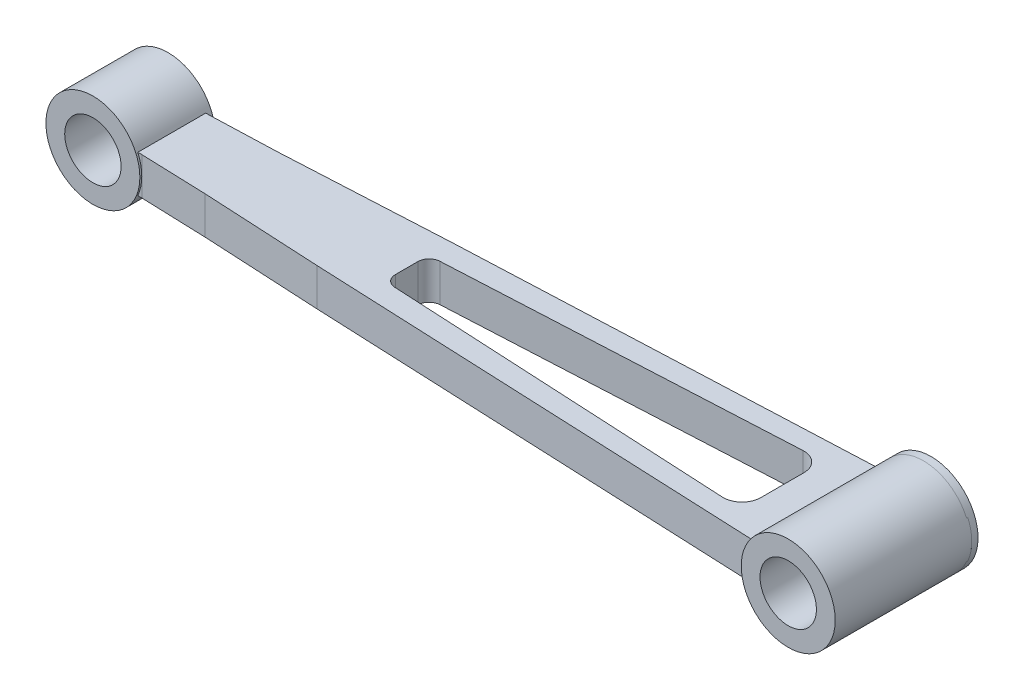
ISO-10303-21;
HEADER;
FILE_DESCRIPTION(('STEP AP214'),'2;1');
FILE_NAME('part.step','',(''),(''),'','','');
FILE_SCHEMA(('AUTOMOTIVE_DESIGN { 1 0 10303 214 1 1 1 1 }'));
ENDSEC;
DATA;
#1=APPLICATION_CONTEXT('core data for automotive mechanical design processes');
#2=APPLICATION_PROTOCOL_DEFINITION('international standard','automotive_design',2000,#1);
#3=PRODUCT_CONTEXT('',#1,'mechanical');
#4=PRODUCT('Part','Part','',(#3));
#5=PRODUCT_RELATED_PRODUCT_CATEGORY('part','',(#4));
#6=PRODUCT_DEFINITION_FORMATION('','',#4);
#7=PRODUCT_DEFINITION_CONTEXT('part definition',#1,'design');
#8=PRODUCT_DEFINITION('design','',#6,#7);
#9=PRODUCT_DEFINITION_SHAPE('','',#8);
#10=(LENGTH_UNIT() NAMED_UNIT(*) SI_UNIT(.MILLI.,.METRE.));
#11=(NAMED_UNIT(*) PLANE_ANGLE_UNIT() SI_UNIT($,.RADIAN.));
#12=(NAMED_UNIT(*) SI_UNIT($,.STERADIAN.) SOLID_ANGLE_UNIT());
#13=UNCERTAINTY_MEASURE_WITH_UNIT(LENGTH_MEASURE(1.E-05),#10,'distance_accuracy_value','');
#14=(GEOMETRIC_REPRESENTATION_CONTEXT(3) GLOBAL_UNCERTAINTY_ASSIGNED_CONTEXT((#13)) GLOBAL_UNIT_ASSIGNED_CONTEXT((#10,
#11,#12)) REPRESENTATION_CONTEXT('',''));
#15=CARTESIAN_POINT('',(0.,0.,0.));
#16=DIRECTION('',(0.,0.,1.));
#17=DIRECTION('',(1.,0.,0.));
#18=AXIS2_PLACEMENT_3D('',#15,#16,#17);
#19=CARTESIAN_POINT('',(0.,10.,0.));
#20=DIRECTION('',(0.,1.,0.));
#21=DIRECTION('',(0.,0.,1.));
#22=AXIS2_PLACEMENT_3D('',#19,#20,#21);
#23=PLANE('',#22);
#24=DIRECTION('',(1.,0.,0.));
#25=VECTOR('',#24,1.);
#26=CARTESIAN_POINT('',(0.,10.,-17.1798568796085));
#27=LINE('',#26,#25);
#28=CARTESIAN_POINT('',(218.516284317725,10.,-17.1798568796085));
#29=VERTEX_POINT('',#28);
#30=CARTESIAN_POINT('',(218.51643923739,10.,-17.1798568796085));
#31=VERTEX_POINT('',#30);
#32=EDGE_CURVE('E323',#29,#31,#27,.T.);
#33=ORIENTED_EDGE('',*,*,#32,.F.);
#34=DIRECTION('',(0.,0.,1.));
#35=VECTOR('',#34,1.);
#36=CARTESIAN_POINT('',(218.516284317725,10.,-18.8580500036445));
#37=LINE('',#36,#35);
#38=CARTESIAN_POINT('',(218.516284317725,10.,-16.8580500036445));
#39=VERTEX_POINT('',#38);
#40=EDGE_CURVE('E61',#29,#39,#37,.T.);
#41=ORIENTED_EDGE('',*,*,#40,.T.);
#42=DIRECTION('',(1.,0.,0.));
#43=VECTOR('',#42,1.);
#44=CARTESIAN_POINT('',(0.,10.,-16.8580500036445));
#45=LINE('',#44,#43);
#46=CARTESIAN_POINT('',(218.51643923739,10.,-16.8580500036445));
#47=VERTEX_POINT('',#46);
#48=EDGE_CURVE('E215',#39,#47,#45,.T.);
#49=ORIENTED_EDGE('',*,*,#48,.T.);
#50=DIRECTION('',(0.,0.,1.));
#51=VECTOR('',#50,1.);
#52=CARTESIAN_POINT('',(218.51643923739,10.,-17.1798568796085));
#53=LINE('',#52,#51);
#54=EDGE_CURVE('E237',#31,#47,#53,.T.);
#55=ORIENTED_EDGE('',*,*,#54,.F.);
#56=EDGE_LOOP('',(#33,#41,#49,#55));
#57=FACE_BOUND('',#56,.T.);
#58=ADVANCED_FACE('F45',(#57),#23,.T.);
#59=CARTESIAN_POINT('',(0.,0.,0.));
#60=DIRECTION('',(0.,1.,0.));
#61=DIRECTION('',(0.,0.,1.));
#62=AXIS2_PLACEMENT_3D('',#59,#60,#61);
#63=PLANE('',#62);
#64=DIRECTION('',(0.,0.,1.));
#65=VECTOR('',#64,1.);
#66=CARTESIAN_POINT('',(218.516284317725,0.,-18.8580500036445));
#67=LINE('',#66,#65);
#68=CARTESIAN_POINT('',(218.516284317725,0.,-17.1798568796085));
#69=VERTEX_POINT('',#68);
#70=CARTESIAN_POINT('',(218.516284317725,0.,-16.8580500036445));
#71=VERTEX_POINT('',#70);
#72=EDGE_CURVE('E11',#69,#71,#67,.T.);
#73=ORIENTED_EDGE('',*,*,#72,.F.);
#74=DIRECTION('',(1.,0.,0.));
#75=VECTOR('',#74,1.);
#76=CARTESIAN_POINT('',(0.,0.,-17.1798568796085));
#77=LINE('',#76,#75);
#78=CARTESIAN_POINT('',(218.51643923739,0.,-17.1798568796085));
#79=VERTEX_POINT('',#78);
#80=EDGE_CURVE('E386',#69,#79,#77,.T.);
#81=ORIENTED_EDGE('',*,*,#80,.T.);
#82=DIRECTION('',(0.,0.,1.));
#83=VECTOR('',#82,1.);
#84=CARTESIAN_POINT('',(218.51643923739,0.,-17.1798568796085));
#85=LINE('',#84,#83);
#86=CARTESIAN_POINT('',(218.51643923739,0.,-16.8580500036445));
#87=VERTEX_POINT('',#86);
#88=EDGE_CURVE('E205',#79,#87,#85,.T.);
#89=ORIENTED_EDGE('',*,*,#88,.T.);
#90=DIRECTION('',(1.,0.,0.));
#91=VECTOR('',#90,1.);
#92=CARTESIAN_POINT('',(0.,0.,-16.8580500036445));
#93=LINE('',#92,#91);
#94=EDGE_CURVE('E201',#71,#87,#93,.T.);
#95=ORIENTED_EDGE('',*,*,#94,.F.);
#96=EDGE_LOOP('',(#73,#81,#89,#95));
#97=FACE_BOUND('',#96,.T.);
#98=ADVANCED_FACE('F203',(#97),#63,.F.);
#99=DIRECTION('',(0.,0.,1.));
#100=VECTOR('',#99,1.);
#101=CARTESIAN_POINT('',(195.60356076261,10.,-16.8580500036445));
#102=LINE('',#101,#100);
#103=CARTESIAN_POINT('',(195.60356076261,10.,-16.67965794013));
#104=VERTEX_POINT('',#103);
#105=CARTESIAN_POINT('',(195.60356076261,10.,16.6417510568769));
#106=VERTEX_POINT('',#105);
#107=EDGE_CURVE('E257',#104,#106,#102,.T.);
#108=ORIENTED_EDGE('',*,*,#107,.F.);
#109=DIRECTION('',(0.999048221581858,0.,-0.0436193873653362));
#110=VECTOR('',#109,1.);
#111=CARTESIAN_POINT('',(-0.354698686758786,10.,-8.12393556185962));
#112=LINE('',#111,#110);
#113=CARTESIAN_POINT('',(86.39,10.,-11.9112908988383));
#114=VERTEX_POINT('',#113);
#115=EDGE_CURVE('E326',#114,#104,#112,.T.);
#116=ORIENTED_EDGE('',*,*,#115,.F.);
#117=DIRECTION('',(0.998629534754574,0.,-0.0523359562429444));
#118=VECTOR('',#117,1.);
#119=CARTESIAN_POINT('',(-0.385907737027346,10.,-7.36355827907058));
#120=LINE('',#119,#118);
#121=CARTESIAN_POINT('',(42.5,10.,-9.6111134661056));
#122=VERTEX_POINT('',#121);
#123=EDGE_CURVE('E330',#122,#114,#120,.T.);
#124=ORIENTED_EDGE('',*,*,#123,.F.);
#125=DIRECTION('',(0.999390827019096,0.,-0.0348994967025017));
#126=VECTOR('',#125,1.);
#127=CARTESIAN_POINT('',(-0.283454760096372,10.,-8.11708230436762));
#128=LINE('',#127,#126);
#129=CARTESIAN_POINT('',(25.,10.,-9.));
#130=VERTEX_POINT('',#129);
#131=EDGE_CURVE('E334',#130,#122,#128,.T.);
#132=ORIENTED_EDGE('',*,*,#131,.F.);
#133=DIRECTION('',(1.,0.,0.));
#134=VECTOR('',#133,1.);
#135=CARTESIAN_POINT('',(0.,10.,-9.));
#136=LINE('',#135,#134);
#137=CARTESIAN_POINT('',(23.9564392373896,10.,-9.));
#138=VERTEX_POINT('',#137);
#139=EDGE_CURVE('E338',#138,#130,#136,.T.);
#140=ORIENTED_EDGE('',*,*,#139,.F.);
#141=DIRECTION('',(0.,0.,1.));
#142=VECTOR('',#141,1.);
#143=CARTESIAN_POINT('',(23.9564392373896,10.,-9.92857142857143));
#144=LINE('',#143,#142);
#145=CARTESIAN_POINT('',(23.9564392373896,10.,9.07142857142857));
#146=VERTEX_POINT('',#145);
#147=EDGE_CURVE('E285',#146,#138,#144,.F.);
#148=ORIENTED_EDGE('',*,*,#147,.F.);
#149=DIRECTION('',(1.,0.,0.));
#150=VECTOR('',#149,1.);
#151=CARTESIAN_POINT('',(0.,10.,9.07142857142857));
#152=LINE('',#151,#150);
#153=CARTESIAN_POINT('',(25.,10.,9.07142857142857));
#154=VERTEX_POINT('',#153);
#155=EDGE_CURVE('E341',#146,#154,#152,.T.);
#156=ORIENTED_EDGE('',*,*,#155,.T.);
#157=DIRECTION('',(0.999390827019096,0.,0.0348994967025011));
#158=VECTOR('',#157,1.);
#159=CARTESIAN_POINT('',(-0.285946062730086,10.,8.18842387759121));
#160=LINE('',#159,#158);
#161=CARTESIAN_POINT('',(42.5,10.,9.68254203753416));
#162=VERTEX_POINT('',#161);
#163=EDGE_CURVE('E344',#154,#162,#160,.T.);
#164=ORIENTED_EDGE('',*,*,#163,.T.);
#165=DIRECTION('',(0.998629534754574,0.,0.052335956242944));
#166=VECTOR('',#165,1.);
#167=CARTESIAN_POINT('',(-0.389640896429759,10.,7.43479120390517));
#168=LINE('',#167,#166);
#169=CARTESIAN_POINT('',(73.89,10.,11.3276222292288));
#170=VERTEX_POINT('',#169);
#171=EDGE_CURVE('E347',#162,#170,#168,.T.);
#172=ORIENTED_EDGE('',*,*,#171,.T.);
#173=DIRECTION('',(0.999048221581858,0.,0.0436193873653361));
#174=VECTOR('',#173,1.);
#175=CARTESIAN_POINT('',(-0.3530467854762,10.,8.08610080217415));
#176=LINE('',#175,#174);
#177=EDGE_CURVE('E319',#170,#106,#176,.T.);
#178=ORIENTED_EDGE('',*,*,#177,.T.);
#179=EDGE_LOOP('',(#108,#116,#124,#132,#140,#148,#156,#164,#172,#178));
#180=FACE_BOUND('',#179,.T.);
#181=CARTESIAN_POINT('',(181.39,10.,-5.69951622560874));
#182=DIRECTION('',(0.,1.,0.));
#183=DIRECTION('',(0.,0.,1.));
#184=AXIS2_PLACEMENT_3D('',#181,#182,#183);
#185=CIRCLE('',#184,5.);
#186=CARTESIAN_POINT('',(186.39,10.,-5.69951622560874));
#187=VERTEX_POINT('',#186);
#188=CARTESIAN_POINT('',(181.13478275941,10.,-10.6929983934057));
#189=VERTEX_POINT('',#188);
#190=EDGE_CURVE('E289',#187,#189,#185,.T.);
#191=ORIENTED_EDGE('',*,*,#190,.F.);
#192=DIRECTION('',(0.,0.,-1.));
#193=VECTOR('',#192,1.);
#194=CARTESIAN_POINT('',(186.39,10.,0.));
#195=LINE('',#194,#193);
#196=CARTESIAN_POINT('',(186.39,10.,5.76341668184965));
#197=VERTEX_POINT('',#196);
#198=EDGE_CURVE('E293',#197,#187,#195,.T.);
#199=ORIENTED_EDGE('',*,*,#198,.F.);
#200=CARTESIAN_POINT('',(181.39,10.,5.76341668184965));
#201=DIRECTION('',(0.,1.,0.));
#202=DIRECTION('',(0.,0.,1.));
#203=AXIS2_PLACEMENT_3D('',#200,#201,#202);
#204=CIRCLE('',#203,5.);
#205=CARTESIAN_POINT('',(181.131319788138,10.,10.7567206529685));
#206=VERTEX_POINT('',#205);
#207=EDGE_CURVE('E298',#197,#206,#204,.F.);
#208=ORIENTED_EDGE('',*,*,#207,.T.);
#209=DIRECTION('',(0.998660794223762,0.,0.0517360423724691));
#210=VECTOR('',#209,1.);
#211=CARTESIAN_POINT('',(-0.0709455084105502,10.,1.36946110538967));
#212=LINE('',#211,#210);
#213=CARTESIAN_POINT('',(89.2347918728826,10.,5.99598238267128));
#214=VERTEX_POINT('',#213);
#215=EDGE_CURVE('E301',#214,#206,#212,.T.);
#216=ORIENTED_EDGE('',*,*,#215,.F.);
#217=CARTESIAN_POINT('',(89.39,10.,3.));
#218=DIRECTION('',(0.,1.,0.));
#219=DIRECTION('',(0.,0.,1.));
#220=AXIS2_PLACEMENT_3D('',#217,#218,#219);
#221=CIRCLE('',#220,3.);
#222=CARTESIAN_POINT('',(86.39,10.,3.));
#223=VERTEX_POINT('',#222);
#224=EDGE_CURVE('E305',#214,#223,#221,.F.);
#225=ORIENTED_EDGE('',*,*,#224,.T.);
#226=DIRECTION('',(0.,0.,1.));
#227=VECTOR('',#226,1.);
#228=CARTESIAN_POINT('',(86.39,10.,0.));
#229=LINE('',#228,#227);
#230=CARTESIAN_POINT('',(86.39,10.,-3.));
#231=VERTEX_POINT('',#230);
#232=EDGE_CURVE('E308',#231,#223,#229,.T.);
#233=ORIENTED_EDGE('',*,*,#232,.F.);
#234=CARTESIAN_POINT('',(89.39,10.,-3.));
#235=DIRECTION('',(0.,1.,0.));
#236=DIRECTION('',(0.,0.,1.));
#237=AXIS2_PLACEMENT_3D('',#234,#235,#236);
#238=CIRCLE('',#237,3.);
#239=CARTESIAN_POINT('',(89.2368696556462,10.,-5.99608930067815));
#240=VERTEX_POINT('',#239);
#241=EDGE_CURVE('E312',#231,#240,#238,.F.);
#242=ORIENTED_EDGE('',*,*,#241,.T.);
#243=DIRECTION('',(-0.998696433559383,0.,0.0510434481179471));
#244=VECTOR('',#243,1.);
#245=CARTESIAN_POINT('',(-0.0731613640039023,10.,-1.4314470514649));
#246=LINE('',#245,#244);
#247=EDGE_CURVE('E315',#189,#240,#246,.T.);
#248=ORIENTED_EDGE('',*,*,#247,.F.);
#249=EDGE_LOOP('',(#191,#199,#208,#216,#225,#233,#242,#248));
#250=FACE_BOUND('',#249,.T.);
#251=ADVANCED_FACE('F516',(#180,#250),#23,.T.);
#252=CARTESIAN_POINT('',(181.39,0.,-5.69951622560874));
#253=DIRECTION('',(0.,1.,0.));
#254=DIRECTION('',(0.,0.,1.));
#255=AXIS2_PLACEMENT_3D('',#252,#253,#254);
#256=CIRCLE('',#255,5.);
#257=CARTESIAN_POINT('',(186.39,0.,-5.69951622560874));
#258=VERTEX_POINT('',#257);
#259=CARTESIAN_POINT('',(181.13478275941,0.,-10.6929983934057));
#260=VERTEX_POINT('',#259);
#261=EDGE_CURVE('E288',#258,#260,#256,.T.);
#262=ORIENTED_EDGE('',*,*,#261,.T.);
#263=DIRECTION('',(-0.998696433559383,0.,0.0510434481179471));
#264=VECTOR('',#263,1.);
#265=CARTESIAN_POINT('',(-0.0731613640039023,0.,-1.4314470514649));
#266=LINE('',#265,#264);
#267=CARTESIAN_POINT('',(89.2368696556462,0.,-5.99608930067815));
#268=VERTEX_POINT('',#267);
#269=EDGE_CURVE('E378',#260,#268,#266,.T.);
#270=ORIENTED_EDGE('',*,*,#269,.T.);
#271=CARTESIAN_POINT('',(89.39,0.,-3.));
#272=DIRECTION('',(0.,1.,0.));
#273=DIRECTION('',(0.,0.,1.));
#274=AXIS2_PLACEMENT_3D('',#271,#272,#273);
#275=CIRCLE('',#274,3.);
#276=CARTESIAN_POINT('',(86.39,0.,-3.));
#277=VERTEX_POINT('',#276);
#278=EDGE_CURVE('E374',#277,#268,#275,.F.);
#279=ORIENTED_EDGE('',*,*,#278,.F.);
#280=DIRECTION('',(0.,0.,1.));
#281=VECTOR('',#280,1.);
#282=CARTESIAN_POINT('',(86.39,0.,0.));
#283=LINE('',#282,#281);
#284=CARTESIAN_POINT('',(86.39,0.,3.));
#285=VERTEX_POINT('',#284);
#286=EDGE_CURVE('E370',#277,#285,#283,.T.);
#287=ORIENTED_EDGE('',*,*,#286,.T.);
#288=CARTESIAN_POINT('',(89.39,0.,3.));
#289=DIRECTION('',(0.,1.,0.));
#290=DIRECTION('',(0.,0.,1.));
#291=AXIS2_PLACEMENT_3D('',#288,#289,#290);
#292=CIRCLE('',#291,3.);
#293=CARTESIAN_POINT('',(89.2347918728826,0.,5.99598238267128));
#294=VERTEX_POINT('',#293);
#295=EDGE_CURVE('E366',#294,#285,#292,.F.);
#296=ORIENTED_EDGE('',*,*,#295,.F.);
#297=DIRECTION('',(0.998660794223762,0.,0.0517360423724691));
#298=VECTOR('',#297,1.);
#299=CARTESIAN_POINT('',(-0.0709455084105502,0.,1.36946110538967));
#300=LINE('',#299,#298);
#301=CARTESIAN_POINT('',(181.131319788138,0.,10.7567206529685));
#302=VERTEX_POINT('',#301);
#303=EDGE_CURVE('E362',#294,#302,#300,.T.);
#304=ORIENTED_EDGE('',*,*,#303,.T.);
#305=CARTESIAN_POINT('',(181.39,0.,5.76341668184965));
#306=DIRECTION('',(0.,1.,0.));
#307=DIRECTION('',(0.,0.,1.));
#308=AXIS2_PLACEMENT_3D('',#305,#306,#307);
#309=CIRCLE('',#308,5.);
#310=CARTESIAN_POINT('',(186.39,0.,5.76341668184965));
#311=VERTEX_POINT('',#310);
#312=EDGE_CURVE('E358',#311,#302,#309,.F.);
#313=ORIENTED_EDGE('',*,*,#312,.F.);
#314=DIRECTION('',(0.,0.,-1.));
#315=VECTOR('',#314,1.);
#316=CARTESIAN_POINT('',(186.39,0.,0.));
#317=LINE('',#316,#315);
#318=EDGE_CURVE('E354',#311,#258,#317,.T.);
#319=ORIENTED_EDGE('',*,*,#318,.T.);
#320=EDGE_LOOP('',(#262,#270,#279,#287,#296,#304,#313,#319));
#321=FACE_BOUND('',#320,.T.);
#322=DIRECTION('',(0.999048221581858,0.,-0.0436193873653362));
#323=VECTOR('',#322,1.);
#324=CARTESIAN_POINT('',(-0.354698686758786,0.,-8.12393556185962));
#325=LINE('',#324,#323);
#326=CARTESIAN_POINT('',(86.39,0.,-11.9112908988383));
#327=VERTEX_POINT('',#326);
#328=CARTESIAN_POINT('',(195.60356076261,0.,-16.67965794013));
#329=VERTEX_POINT('',#328);
#330=EDGE_CURVE('E389',#327,#329,#325,.T.);
#331=ORIENTED_EDGE('',*,*,#330,.T.);
#332=DIRECTION('',(0.,0.,1.));
#333=VECTOR('',#332,1.);
#334=CARTESIAN_POINT('',(195.60356076261,0.,-16.8580500036445));
#335=LINE('',#334,#333);
#336=CARTESIAN_POINT('',(195.60356076261,0.,16.6417510568769));
#337=VERTEX_POINT('',#336);
#338=EDGE_CURVE('E54',#329,#337,#335,.T.);
#339=ORIENTED_EDGE('',*,*,#338,.T.);
#340=DIRECTION('',(0.999048221581858,0.,0.0436193873653361));
#341=VECTOR('',#340,1.);
#342=CARTESIAN_POINT('',(-0.3530467854762,0.,8.08610080217415));
#343=LINE('',#342,#341);
#344=CARTESIAN_POINT('',(73.89,0.,11.3276222292288));
#345=VERTEX_POINT('',#344);
#346=EDGE_CURVE('E382',#345,#337,#343,.T.);
#347=ORIENTED_EDGE('',*,*,#346,.F.);
#348=DIRECTION('',(0.998629534754574,0.,0.052335956242944));
#349=VECTOR('',#348,1.);
#350=CARTESIAN_POINT('',(-0.389640896429759,0.,7.43479120390517));
#351=LINE('',#350,#349);
#352=CARTESIAN_POINT('',(42.5,0.,9.68254203753416));
#353=VERTEX_POINT('',#352);
#354=EDGE_CURVE('E294',#353,#345,#351,.T.);
#355=ORIENTED_EDGE('',*,*,#354,.F.);
#356=DIRECTION('',(0.999390827019096,0.,0.0348994967025011));
#357=VECTOR('',#356,1.);
#358=CARTESIAN_POINT('',(-0.285946062730086,0.,8.18842387759121));
#359=LINE('',#358,#357);
#360=CARTESIAN_POINT('',(25.,0.,9.07142857142857));
#361=VERTEX_POINT('',#360);
#362=EDGE_CURVE('E409',#361,#353,#359,.T.);
#363=ORIENTED_EDGE('',*,*,#362,.F.);
#364=DIRECTION('',(1.,0.,0.));
#365=VECTOR('',#364,1.);
#366=CARTESIAN_POINT('',(0.,0.,9.07142857142857));
#367=LINE('',#366,#365);
#368=CARTESIAN_POINT('',(23.9564392373896,0.,9.07142857142857));
#369=VERTEX_POINT('',#368);
#370=EDGE_CURVE('E405',#369,#361,#367,.T.);
#371=ORIENTED_EDGE('',*,*,#370,.F.);
#372=DIRECTION('',(0.,0.,1.));
#373=VECTOR('',#372,1.);
#374=CARTESIAN_POINT('',(23.9564392373896,0.,-9.92857142857143));
#375=LINE('',#374,#373);
#376=CARTESIAN_POINT('',(23.9564392373896,0.,-9.));
#377=VERTEX_POINT('',#376);
#378=EDGE_CURVE('E210',#369,#377,#375,.F.);
#379=ORIENTED_EDGE('',*,*,#378,.T.);
#380=DIRECTION('',(1.,0.,0.));
#381=VECTOR('',#380,1.);
#382=CARTESIAN_POINT('',(0.,0.,-9.));
#383=LINE('',#382,#381);
#384=CARTESIAN_POINT('',(25.,0.,-9.));
#385=VERTEX_POINT('',#384);
#386=EDGE_CURVE('E401',#377,#385,#383,.T.);
#387=ORIENTED_EDGE('',*,*,#386,.T.);
#388=DIRECTION('',(0.999390827019096,0.,-0.0348994967025017));
#389=VECTOR('',#388,1.);
#390=CARTESIAN_POINT('',(-0.283454760096372,0.,-8.11708230436762));
#391=LINE('',#390,#389);
#392=CARTESIAN_POINT('',(42.5,0.,-9.6111134661056));
#393=VERTEX_POINT('',#392);
#394=EDGE_CURVE('E397',#385,#393,#391,.T.);
#395=ORIENTED_EDGE('',*,*,#394,.T.);
#396=DIRECTION('',(0.998629534754574,0.,-0.0523359562429444));
#397=VECTOR('',#396,1.);
#398=CARTESIAN_POINT('',(-0.385907737027346,0.,-7.36355827907058));
#399=LINE('',#398,#397);
#400=EDGE_CURVE('E393',#393,#327,#399,.T.);
#401=ORIENTED_EDGE('',*,*,#400,.T.);
#402=EDGE_LOOP('',(#331,#339,#347,#355,#363,#371,#379,#387,#395,#401));
#403=FACE_BOUND('',#402,.T.);
#404=ADVANCED_FACE('F467',(#321,#403),#63,.F.);
#405=CARTESIAN_POINT('',(0.,10.,9.07142857142857));
#406=DIRECTION('',(0.,0.,-1.));
#407=DIRECTION('',(-1.,0.,0.));
#408=AXIS2_PLACEMENT_3D('',#405,#406,#407);
#409=PLANE('',#408);
#410=CARTESIAN_POINT('',(12.5,5.,9.07142857142857));
#411=DIRECTION('',(0.,0.,1.));
#412=DIRECTION('',(1.,0.,0.));
#413=AXIS2_PLACEMENT_3D('',#410,#411,#412);
#414=CIRCLE('',#413,12.5);
#415=CARTESIAN_POINT('',(25.,5.,9.07142857142857));
#416=VERTEX_POINT('',#415);
#417=EDGE_CURVE('E272',#369,#416,#414,.T.);
#418=ORIENTED_EDGE('',*,*,#417,.F.);
#419=ORIENTED_EDGE('',*,*,#370,.T.);
#420=DIRECTION('',(0.,-1.,0.));
#421=VECTOR('',#420,1.);
#422=CARTESIAN_POINT('',(25.,10.,9.07142857142857));
#423=LINE('',#422,#421);
#424=EDGE_CURVE('E423',#416,#361,#423,.T.);
#425=ORIENTED_EDGE('',*,*,#424,.F.);
#426=EDGE_LOOP('',(#418,#419,#425));
#427=FACE_BOUND('',#426,.T.);
#428=ADVANCED_FACE('F491',(#427),#409,.F.);
#429=EDGE_CURVE('E278',#416,#146,#414,.T.);
#430=ORIENTED_EDGE('',*,*,#429,.F.);
#431=EDGE_CURVE('E424',#154,#416,#423,.T.);
#432=ORIENTED_EDGE('',*,*,#431,.F.);
#433=ORIENTED_EDGE('',*,*,#155,.F.);
#434=EDGE_LOOP('',(#430,#432,#433));
#435=FACE_BOUND('',#434,.T.);
#436=ADVANCED_FACE('F521',(#435),#409,.F.);
#437=CARTESIAN_POINT('',(12.5,5.,-9.92857142857143));
#438=DIRECTION('',(0.,0.,1.));
#439=DIRECTION('',(1.,0.,0.));
#440=AXIS2_PLACEMENT_3D('',#437,#438,#439);
#441=CYLINDRICAL_SURFACE('',#440,12.5);
#442=ORIENTED_EDGE('',*,*,#378,.F.);
#443=ORIENTED_EDGE('',*,*,#417,.T.);
#444=ORIENTED_EDGE('',*,*,#429,.T.);
#445=ORIENTED_EDGE('',*,*,#147,.T.);
#446=CARTESIAN_POINT('',(12.5,5.,-9.));
#447=DIRECTION('',(0.,0.,-1.));
#448=DIRECTION('',(-1.,0.,0.));
#449=AXIS2_PLACEMENT_3D('',#446,#447,#448);
#450=CIRCLE('',#449,12.5);
#451=CARTESIAN_POINT('',(25.,5.,-9.));
#452=VERTEX_POINT('',#451);
#453=EDGE_CURVE('E284',#138,#452,#450,.T.);
#454=ORIENTED_EDGE('',*,*,#453,.T.);
#455=EDGE_CURVE('E277',#452,#377,#450,.T.);
#456=ORIENTED_EDGE('',*,*,#455,.T.);
#457=EDGE_LOOP('',(#442,#443,#444,#445,#454,#456));
#458=FACE_BOUND('',#457,.T.);
#459=CARTESIAN_POINT('',(12.5,5.,9.57142857142857));
#460=DIRECTION('',(0.,0.,1.));
#461=DIRECTION('',(1.,0.,0.));
#462=AXIS2_PLACEMENT_3D('',#459,#460,#461);
#463=CIRCLE('',#462,12.5);
#464=CARTESIAN_POINT('',(25.,5.,9.57142857142857));
#465=VERTEX_POINT('',#464);
#466=EDGE_CURVE('E273',#465,#465,#463,.T.);
#467=ORIENTED_EDGE('',*,*,#466,.F.);
#468=EDGE_LOOP('',(#467));
#469=FACE_BOUND('',#468,.T.);
#470=CARTESIAN_POINT('',(12.5,5.,-10.4285714285714));
#471=DIRECTION('',(0.,0.,-1.));
#472=DIRECTION('',(-1.,0.,0.));
#473=AXIS2_PLACEMENT_3D('',#470,#471,#472);
#474=CIRCLE('',#473,12.5);
#475=CARTESIAN_POINT('',(0.,5.,-10.4285714285714));
#476=VERTEX_POINT('',#475);
#477=EDGE_CURVE('E268',#476,#476,#474,.T.);
#478=ORIENTED_EDGE('',*,*,#477,.F.);
#479=EDGE_LOOP('',(#478));
#480=FACE_BOUND('',#479,.T.);
#481=ADVANCED_FACE('F522',(#458,#469,#480),#441,.T.);
#482=CARTESIAN_POINT('',(0.,10.,-9.));
#483=DIRECTION('',(0.,0.,-1.));
#484=DIRECTION('',(-1.,0.,0.));
#485=AXIS2_PLACEMENT_3D('',#482,#483,#484);
#486=PLANE('',#485);
#487=ORIENTED_EDGE('',*,*,#453,.F.);
#488=ORIENTED_EDGE('',*,*,#139,.T.);
#489=DIRECTION('',(0.,-1.,0.));
#490=VECTOR('',#489,1.);
#491=CARTESIAN_POINT('',(25.,10.,-9.));
#492=LINE('',#491,#490);
#493=EDGE_CURVE('E429',#130,#452,#492,.T.);
#494=ORIENTED_EDGE('',*,*,#493,.T.);
#495=EDGE_LOOP('',(#487,#488,#494));
#496=FACE_BOUND('',#495,.T.);
#497=ADVANCED_FACE('F526',(#496),#486,.T.);
#498=ORIENTED_EDGE('',*,*,#455,.F.);
#499=EDGE_CURVE('E428',#452,#385,#492,.T.);
#500=ORIENTED_EDGE('',*,*,#499,.T.);
#501=ORIENTED_EDGE('',*,*,#386,.F.);
#502=EDGE_LOOP('',(#498,#500,#501));
#503=FACE_BOUND('',#502,.T.);
#504=ADVANCED_FACE('F500',(#503),#486,.T.);
#505=CARTESIAN_POINT('',(-0.3530467854762,10.,8.08610080217415));
#506=DIRECTION('',(0.0436193873653361,0.,-0.999048221581858));
#507=DIRECTION('',(-0.999048221581858,0.,-0.0436193873653361));
#508=AXIS2_PLACEMENT_3D('',#505,#506,#507);
#509=PLANE('',#508);
#510=ORIENTED_EDGE('',*,*,#346,.T.);
#511=CARTESIAN_POINT('',(207.06,5.,17.1419499963554));
#512=DIRECTION('',(0.0436193873653361,0.,-0.999048221581858));
#513=DIRECTION('',(0.999048221581858,0.,0.0436193873653361));
#514=AXIS2_PLACEMENT_3D('',#511,#512,#513);
#515=ELLIPSE('',#514,12.5119085645415,12.5);
#516=EDGE_CURVE('E253',#337,#106,#515,.T.);
#517=ORIENTED_EDGE('',*,*,#516,.T.);
#518=ORIENTED_EDGE('',*,*,#177,.F.);
#519=DIRECTION('',(0.,-1.,0.));
#520=VECTOR('',#519,1.);
#521=CARTESIAN_POINT('',(73.89,10.,11.3276222292288));
#522=LINE('',#521,#520);
#523=EDGE_CURVE('E414',#170,#345,#522,.T.);
#524=ORIENTED_EDGE('',*,*,#523,.T.);
#525=EDGE_LOOP('',(#510,#517,#518,#524));
#526=FACE_BOUND('',#525,.T.);
#527=ADVANCED_FACE('F473',(#526),#509,.F.);
#528=CARTESIAN_POINT('',(-0.354698686758786,10.,-8.12393556185962));
#529=DIRECTION('',(-0.0436193873653362,0.,-0.999048221581858));
#530=DIRECTION('',(-0.999048221581858,0.,0.0436193873653362));
#531=AXIS2_PLACEMENT_3D('',#528,#529,#530);
#532=PLANE('',#531);
#533=CARTESIAN_POINT('',(207.06,5.,-17.1798568796085));
#534=DIRECTION('',(-0.0436193873653362,0.,-0.999048221581858));
#535=DIRECTION('',(-0.999048221581858,0.,0.0436193873653362));
#536=AXIS2_PLACEMENT_3D('',#533,#534,#535);
#537=ELLIPSE('',#536,12.5119085645415,12.5);
#538=EDGE_CURVE('E250',#329,#104,#537,.T.);
#539=ORIENTED_EDGE('',*,*,#538,.F.);
#540=ORIENTED_EDGE('',*,*,#330,.F.);
#541=DIRECTION('',(0.,-1.,0.));
#542=VECTOR('',#541,1.);
#543=CARTESIAN_POINT('',(86.39,10.,-11.9112908988383));
#544=LINE('',#543,#542);
#545=EDGE_CURVE('E436',#114,#327,#544,.T.);
#546=ORIENTED_EDGE('',*,*,#545,.F.);
#547=ORIENTED_EDGE('',*,*,#115,.T.);
#548=EDGE_LOOP('',(#539,#540,#546,#547));
#549=FACE_BOUND('',#548,.T.);
#550=ADVANCED_FACE('F512',(#549),#532,.T.);
#551=CARTESIAN_POINT('',(-0.385907737027346,10.,-7.36355827907058));
#552=DIRECTION('',(-0.0523359562429443,0.,-0.998629534754574));
#553=DIRECTION('',(-0.998629534754574,0.,0.0523359562429444));
#554=AXIS2_PLACEMENT_3D('',#551,#552,#553);
#555=PLANE('',#554);
#556=ORIENTED_EDGE('',*,*,#400,.F.);
#557=DIRECTION('',(0.,-1.,0.));
#558=VECTOR('',#557,1.);
#559=CARTESIAN_POINT('',(42.5,10.,-9.6111134661056));
#560=LINE('',#559,#558);
#561=EDGE_CURVE('E433',#122,#393,#560,.T.);
#562=ORIENTED_EDGE('',*,*,#561,.F.);
#563=ORIENTED_EDGE('',*,*,#123,.T.);
#564=ORIENTED_EDGE('',*,*,#545,.T.);
#565=EDGE_LOOP('',(#556,#562,#563,#564));
#566=FACE_BOUND('',#565,.T.);
#567=ADVANCED_FACE('F509',(#566),#555,.T.);
#568=CARTESIAN_POINT('',(-0.283454760096372,10.,-8.11708230436762));
#569=DIRECTION('',(-0.0348994967025017,0.,-0.999390827019096));
#570=DIRECTION('',(-0.999390827019096,0.,0.0348994967025017));
#571=AXIS2_PLACEMENT_3D('',#568,#569,#570);
#572=PLANE('',#571);
#573=ORIENTED_EDGE('',*,*,#394,.F.);
#574=ORIENTED_EDGE('',*,*,#499,.F.);
#575=ORIENTED_EDGE('',*,*,#493,.F.);
#576=ORIENTED_EDGE('',*,*,#131,.T.);
#577=ORIENTED_EDGE('',*,*,#561,.T.);
#578=EDGE_LOOP('',(#573,#574,#575,#576,#577));
#579=FACE_BOUND('',#578,.T.);
#580=ADVANCED_FACE('F504',(#579),#572,.T.);
#581=CARTESIAN_POINT('',(-0.285946062730086,10.,8.18842387759121));
#582=DIRECTION('',(0.034899496702501,0.,-0.999390827019096));
#583=DIRECTION('',(-0.999390827019096,0.,-0.034899496702501));
#584=AXIS2_PLACEMENT_3D('',#581,#582,#583);
#585=PLANE('',#584);
#586=ORIENTED_EDGE('',*,*,#362,.T.);
#587=DIRECTION('',(0.,-1.,0.));
#588=VECTOR('',#587,1.);
#589=CARTESIAN_POINT('',(42.5,10.,9.68254203753416));
#590=LINE('',#589,#588);
#591=EDGE_CURVE('E418',#162,#353,#590,.T.);
#592=ORIENTED_EDGE('',*,*,#591,.F.);
#593=ORIENTED_EDGE('',*,*,#163,.F.);
#594=ORIENTED_EDGE('',*,*,#431,.T.);
#595=ORIENTED_EDGE('',*,*,#424,.T.);
#596=EDGE_LOOP('',(#586,#592,#593,#594,#595));
#597=FACE_BOUND('',#596,.T.);
#598=ADVANCED_FACE('F483',(#597),#585,.F.);
#599=CARTESIAN_POINT('',(181.39,10.,-5.69951622560874));
#600=DIRECTION('',(0.,-1.,0.));
#601=DIRECTION('',(0.,0.,-1.));
#602=AXIS2_PLACEMENT_3D('',#599,#600,#601);
#603=CYLINDRICAL_SURFACE('',#602,5.);
#604=ORIENTED_EDGE('',*,*,#261,.F.);
#605=DIRECTION('',(0.,-1.,0.));
#606=VECTOR('',#605,1.);
#607=CARTESIAN_POINT('',(186.39,10.,-5.69951622560874));
#608=LINE('',#607,#606);
#609=EDGE_CURVE('E419',#187,#258,#608,.T.);
#610=ORIENTED_EDGE('',*,*,#609,.F.);
#611=ORIENTED_EDGE('',*,*,#190,.T.);
#612=DIRECTION('',(0.,-1.,0.));
#613=VECTOR('',#612,1.);
#614=CARTESIAN_POINT('',(181.13478275941,10.,-10.6929983934057));
#615=LINE('',#614,#613);
#616=EDGE_CURVE('E350',#189,#260,#615,.T.);
#617=ORIENTED_EDGE('',*,*,#616,.T.);
#618=EDGE_LOOP('',(#604,#610,#611,#617));
#619=FACE_BOUND('',#618,.T.);
#620=ADVANCED_FACE('F47',(#619),#603,.F.);
#621=CARTESIAN_POINT('',(186.39,10.,0.));
#622=DIRECTION('',(-1.,0.,0.));
#623=DIRECTION('',(0.,0.,1.));
#624=AXIS2_PLACEMENT_3D('',#621,#622,#623);
#625=PLANE('',#624);
#626=ORIENTED_EDGE('',*,*,#318,.F.);
#627=DIRECTION('',(0.,-1.,0.));
#628=VECTOR('',#627,1.);
#629=CARTESIAN_POINT('',(186.39,10.,5.76341668184965));
#630=LINE('',#629,#628);
#631=EDGE_CURVE('E456',#197,#311,#630,.T.);
#632=ORIENTED_EDGE('',*,*,#631,.F.);
#633=ORIENTED_EDGE('',*,*,#198,.T.);
#634=ORIENTED_EDGE('',*,*,#609,.T.);
#635=EDGE_LOOP('',(#626,#632,#633,#634));
#636=FACE_BOUND('',#635,.T.);
#637=ADVANCED_FACE('F563',(#636),#625,.T.);
#638=CARTESIAN_POINT('',(181.39,10.,5.76341668184965));
#639=DIRECTION('',(0.,-1.,0.));
#640=DIRECTION('',(0.,0.,-1.));
#641=AXIS2_PLACEMENT_3D('',#638,#639,#640);
#642=CYLINDRICAL_SURFACE('',#641,5.);
#643=ORIENTED_EDGE('',*,*,#312,.T.);
#644=DIRECTION('',(0.,-1.,0.));
#645=VECTOR('',#644,1.);
#646=CARTESIAN_POINT('',(181.131319788138,10.,10.7567206529685));
#647=LINE('',#646,#645);
#648=EDGE_CURVE('E453',#206,#302,#647,.T.);
#649=ORIENTED_EDGE('',*,*,#648,.F.);
#650=ORIENTED_EDGE('',*,*,#207,.F.);
#651=ORIENTED_EDGE('',*,*,#631,.T.);
#652=EDGE_LOOP('',(#643,#649,#650,#651));
#653=FACE_BOUND('',#652,.T.);
#654=ADVANCED_FACE('F596',(#653),#642,.F.);
#655=CARTESIAN_POINT('',(-0.0709455084105502,10.,1.36946110538967));
#656=DIRECTION('',(0.0517360423724691,0.,-0.998660794223761));
#657=DIRECTION('',(-0.998660794223762,0.,-0.0517360423724692));
#658=AXIS2_PLACEMENT_3D('',#655,#656,#657);
#659=PLANE('',#658);
#660=ORIENTED_EDGE('',*,*,#303,.F.);
#661=DIRECTION('',(0.,-1.,0.));
#662=VECTOR('',#661,1.);
#663=CARTESIAN_POINT('',(89.2347918728826,10.,5.99598238267128));
#664=LINE('',#663,#662);
#665=EDGE_CURVE('E450',#214,#294,#664,.T.);
#666=ORIENTED_EDGE('',*,*,#665,.F.);
#667=ORIENTED_EDGE('',*,*,#215,.T.);
#668=ORIENTED_EDGE('',*,*,#648,.T.);
#669=EDGE_LOOP('',(#660,#666,#667,#668));
#670=FACE_BOUND('',#669,.T.);
#671=ADVANCED_FACE('F592',(#670),#659,.T.);
#672=CARTESIAN_POINT('',(89.39,10.,3.));
#673=DIRECTION('',(0.,-1.,0.));
#674=DIRECTION('',(0.,0.,-1.));
#675=AXIS2_PLACEMENT_3D('',#672,#673,#674);
#676=CYLINDRICAL_SURFACE('',#675,3.);
#677=ORIENTED_EDGE('',*,*,#295,.T.);
#678=DIRECTION('',(0.,-1.,0.));
#679=VECTOR('',#678,1.);
#680=CARTESIAN_POINT('',(86.39,10.,3.));
#681=LINE('',#680,#679);
#682=EDGE_CURVE('E447',#223,#285,#681,.T.);
#683=ORIENTED_EDGE('',*,*,#682,.F.);
#684=ORIENTED_EDGE('',*,*,#224,.F.);
#685=ORIENTED_EDGE('',*,*,#665,.T.);
#686=EDGE_LOOP('',(#677,#683,#684,#685));
#687=FACE_BOUND('',#686,.T.);
#688=ADVANCED_FACE('F588',(#687),#676,.F.);
#689=CARTESIAN_POINT('',(86.39,10.,0.));
#690=DIRECTION('',(1.,0.,0.));
#691=DIRECTION('',(0.,0.,-1.));
#692=AXIS2_PLACEMENT_3D('',#689,#690,#691);
#693=PLANE('',#692);
#694=ORIENTED_EDGE('',*,*,#286,.F.);
#695=DIRECTION('',(0.,-1.,0.));
#696=VECTOR('',#695,1.);
#697=CARTESIAN_POINT('',(86.39,10.,-3.));
#698=LINE('',#697,#696);
#699=EDGE_CURVE('E444',#231,#277,#698,.T.);
#700=ORIENTED_EDGE('',*,*,#699,.F.);
#701=ORIENTED_EDGE('',*,*,#232,.T.);
#702=ORIENTED_EDGE('',*,*,#682,.T.);
#703=EDGE_LOOP('',(#694,#700,#701,#702));
#704=FACE_BOUND('',#703,.T.);
#705=ADVANCED_FACE('F584',(#704),#693,.T.);
#706=CARTESIAN_POINT('',(89.39,10.,-3.));
#707=DIRECTION('',(0.,-1.,0.));
#708=DIRECTION('',(0.,0.,-1.));
#709=AXIS2_PLACEMENT_3D('',#706,#707,#708);
#710=CYLINDRICAL_SURFACE('',#709,3.);
#711=ORIENTED_EDGE('',*,*,#278,.T.);
#712=DIRECTION('',(0.,-1.,0.));
#713=VECTOR('',#712,1.);
#714=CARTESIAN_POINT('',(89.2368696556462,10.,-5.99608930067815));
#715=LINE('',#714,#713);
#716=EDGE_CURVE('E441',#240,#268,#715,.T.);
#717=ORIENTED_EDGE('',*,*,#716,.F.);
#718=ORIENTED_EDGE('',*,*,#241,.F.);
#719=ORIENTED_EDGE('',*,*,#699,.T.);
#720=EDGE_LOOP('',(#711,#717,#718,#719));
#721=FACE_BOUND('',#720,.T.);
#722=ADVANCED_FACE('F580',(#721),#710,.F.);
#723=CARTESIAN_POINT('',(-0.0731613640039023,10.,-1.4314470514649));
#724=DIRECTION('',(0.0510434481179471,0.,0.998696433559383));
#725=DIRECTION('',(0.998696433559383,0.,-0.0510434481179471));
#726=AXIS2_PLACEMENT_3D('',#723,#724,#725);
#727=PLANE('',#726);
#728=ORIENTED_EDGE('',*,*,#269,.F.);
#729=ORIENTED_EDGE('',*,*,#616,.F.);
#730=ORIENTED_EDGE('',*,*,#247,.T.);
#731=ORIENTED_EDGE('',*,*,#716,.T.);
#732=EDGE_LOOP('',(#728,#729,#730,#731));
#733=FACE_BOUND('',#732,.T.);
#734=ADVANCED_FACE('F557',(#733),#727,.T.);
#735=CARTESIAN_POINT('',(-0.389640896429759,10.,7.43479120390517));
#736=DIRECTION('',(0.0523359562429439,0.,-0.998629534754574));
#737=DIRECTION('',(-0.998629534754574,0.,-0.052335956242944));
#738=AXIS2_PLACEMENT_3D('',#735,#736,#737);
#739=PLANE('',#738);
#740=ORIENTED_EDGE('',*,*,#354,.T.);
#741=ORIENTED_EDGE('',*,*,#523,.F.);
#742=ORIENTED_EDGE('',*,*,#171,.F.);
#743=ORIENTED_EDGE('',*,*,#591,.T.);
#744=EDGE_LOOP('',(#740,#741,#742,#743));
#745=FACE_BOUND('',#744,.T.);
#746=ADVANCED_FACE('F478',(#745),#739,.F.);
#747=CARTESIAN_POINT('',(12.5,5.,9.57142857142857));
#748=DIRECTION('',(0.,0.,1.));
#749=DIRECTION('',(1.,0.,0.));
#750=AXIS2_PLACEMENT_3D('',#747,#748,#749);
#751=PLANE('',#750);
#752=CARTESIAN_POINT('',(12.5,5.,9.57142857142857));
#753=DIRECTION('',(0.,0.,1.));
#754=DIRECTION('',(1.,0.,0.));
#755=AXIS2_PLACEMENT_3D('',#752,#753,#754);
#756=CIRCLE('',#755,7.5);
#757=CARTESIAN_POINT('',(20.,5.,9.57142857142857));
#758=VERTEX_POINT('',#757);
#759=EDGE_CURVE('E264',#758,#758,#756,.T.);
#760=ORIENTED_EDGE('',*,*,#759,.F.);
#761=EDGE_LOOP('',(#760));
#762=FACE_BOUND('',#761,.T.);
#763=ORIENTED_EDGE('',*,*,#466,.T.);
#764=EDGE_LOOP('',(#763));
#765=FACE_BOUND('',#764,.T.);
#766=ADVANCED_FACE('F556',(#762,#765),#751,.T.);
#767=CARTESIAN_POINT('',(12.5,5.,-10.4285714285714));
#768=DIRECTION('',(0.,0.,-1.));
#769=DIRECTION('',(-1.,0.,0.));
#770=AXIS2_PLACEMENT_3D('',#767,#768,#769);
#771=PLANE('',#770);
#772=CARTESIAN_POINT('',(12.5,5.,-10.4285714285714));
#773=DIRECTION('',(0.,0.,-1.));
#774=DIRECTION('',(-1.,0.,0.));
#775=AXIS2_PLACEMENT_3D('',#772,#773,#774);
#776=CIRCLE('',#775,7.5);
#777=CARTESIAN_POINT('',(5.,5.,-10.4285714285714));
#778=VERTEX_POINT('',#777);
#779=EDGE_CURVE('E260',#778,#778,#776,.T.);
#780=ORIENTED_EDGE('',*,*,#779,.F.);
#781=EDGE_LOOP('',(#780));
#782=FACE_BOUND('',#781,.T.);
#783=ORIENTED_EDGE('',*,*,#477,.T.);
#784=EDGE_LOOP('',(#783));
#785=FACE_BOUND('',#784,.T.);
#786=ADVANCED_FACE('F714',(#782,#785),#771,.T.);
#787=CARTESIAN_POINT('',(12.5,5.,17.1419499963554));
#788=DIRECTION('',(0.,0.,-1.));
#789=DIRECTION('',(-1.,0.,0.));
#790=AXIS2_PLACEMENT_3D('',#787,#788,#789);
#791=CYLINDRICAL_SURFACE('',#790,7.5);
#792=ORIENTED_EDGE('',*,*,#759,.T.);
#793=EDGE_LOOP('',(#792));
#794=FACE_BOUND('',#793,.T.);
#795=ORIENTED_EDGE('',*,*,#779,.T.);
#796=EDGE_LOOP('',(#795));
#797=FACE_BOUND('',#796,.T.);
#798=ADVANCED_FACE('F723',(#794,#797),#791,.F.);
#799=CARTESIAN_POINT('',(207.06,5.,-16.8580500036445));
#800=DIRECTION('',(0.,0.,1.));
#801=DIRECTION('',(1.,0.,0.));
#802=AXIS2_PLACEMENT_3D('',#799,#800,#801);
#803=CYLINDRICAL_SURFACE('',#802,12.5);
#804=CARTESIAN_POINT('',(207.06,5.,19.1419499963555));
#805=DIRECTION('',(0.,0.,1.));
#806=DIRECTION('',(1.,0.,0.));
#807=AXIS2_PLACEMENT_3D('',#804,#805,#806);
#808=CIRCLE('',#807,12.5);
#809=CARTESIAN_POINT('',(219.56,5.,19.1419499963555));
#810=VERTEX_POINT('',#809);
#811=EDGE_CURVE('E241',#810,#810,#808,.T.);
#812=ORIENTED_EDGE('',*,*,#811,.F.);
#813=EDGE_LOOP('',(#812));
#814=FACE_BOUND('',#813,.T.);
#815=ORIENTED_EDGE('',*,*,#88,.F.);
#816=CARTESIAN_POINT('',(207.06,5.,-17.1798568796085));
#817=DIRECTION('',(0.,0.,-1.));
#818=DIRECTION('',(1.,0.,0.));
#819=AXIS2_PLACEMENT_3D('',#816,#817,#818);
#820=CIRCLE('',#819,12.4999999999998);
#821=EDGE_CURVE('E233',#31,#79,#820,.T.);
#822=ORIENTED_EDGE('',*,*,#821,.F.);
#823=ORIENTED_EDGE('',*,*,#54,.T.);
#824=CARTESIAN_POINT('',(207.06,5.,-16.8580500036445));
#825=DIRECTION('',(0.,0.,1.));
#826=DIRECTION('',(1.,0.,0.));
#827=AXIS2_PLACEMENT_3D('',#824,#825,#826);
#828=CIRCLE('',#827,12.5);
#829=EDGE_CURVE('E245',#47,#87,#828,.T.);
#830=ORIENTED_EDGE('',*,*,#829,.T.);
#831=EDGE_LOOP('',(#815,#822,#823,#830));
#832=FACE_BOUND('',#831,.T.);
#833=ORIENTED_EDGE('',*,*,#538,.T.);
#834=ORIENTED_EDGE('',*,*,#107,.T.);
#835=ORIENTED_EDGE('',*,*,#516,.F.);
#836=ORIENTED_EDGE('',*,*,#338,.F.);
#837=EDGE_LOOP('',(#833,#834,#835,#836));
#838=FACE_BOUND('',#837,.T.);
#839=ADVANCED_FACE('F514',(#814,#832,#838),#803,.T.);
#840=CARTESIAN_POINT('',(207.06,5.,-16.8580500036445));
#841=DIRECTION('',(0.,0.,1.));
#842=DIRECTION('',(1.,0.,0.));
#843=AXIS2_PLACEMENT_3D('',#840,#841,#842);
#844=PLANE('',#843);
#845=CARTESIAN_POINT('',(207.06,5.,-16.8580500036445));
#846=DIRECTION('',(0.,0.,-1.));
#847=DIRECTION('',(-1.,0.,0.));
#848=AXIS2_PLACEMENT_3D('',#845,#846,#847);
#849=CIRCLE('',#848,12.4998580139356);
#850=EDGE_CURVE('E213',#71,#39,#849,.T.);
#851=ORIENTED_EDGE('',*,*,#850,.F.);
#852=ORIENTED_EDGE('',*,*,#94,.T.);
#853=ORIENTED_EDGE('',*,*,#829,.F.);
#854=ORIENTED_EDGE('',*,*,#48,.F.);
#855=EDGE_LOOP('',(#851,#852,#853,#854));
#856=FACE_BOUND('',#855,.T.);
#857=ADVANCED_FACE('F214',(#856),#844,.F.);
#858=CARTESIAN_POINT('',(0.,10.,-17.1798568796085));
#859=DIRECTION('',(0.,0.,-1.));
#860=DIRECTION('',(-1.,0.,0.));
#861=AXIS2_PLACEMENT_3D('',#858,#859,#860);
#862=PLANE('',#861);
#863=ORIENTED_EDGE('',*,*,#80,.F.);
#864=CARTESIAN_POINT('',(207.06,5.,-17.1798568796085));
#865=DIRECTION('',(0.,0.,-1.));
#866=DIRECTION('',(-1.,0.,0.));
#867=AXIS2_PLACEMENT_3D('',#864,#865,#866);
#868=CIRCLE('',#867,12.4998580139356);
#869=EDGE_CURVE('E69',#69,#29,#868,.F.);
#870=ORIENTED_EDGE('',*,*,#869,.T.);
#871=ORIENTED_EDGE('',*,*,#32,.T.);
#872=ORIENTED_EDGE('',*,*,#821,.T.);
#873=EDGE_LOOP('',(#863,#870,#871,#872));
#874=FACE_BOUND('',#873,.T.);
#875=ADVANCED_FACE('F573',(#874),#862,.T.);
#876=CARTESIAN_POINT('',(207.06,5.,19.1419499963555));
#877=DIRECTION('',(0.,0.,1.));
#878=DIRECTION('',(1.,0.,0.));
#879=AXIS2_PLACEMENT_3D('',#876,#877,#878);
#880=PLANE('',#879);
#881=CARTESIAN_POINT('',(207.06,5.,19.1419499963555));
#882=DIRECTION('',(0.,0.,-1.));
#883=DIRECTION('',(-1.,0.,0.));
#884=AXIS2_PLACEMENT_3D('',#881,#882,#883);
#885=CIRCLE('',#884,7.50000000000001);
#886=CARTESIAN_POINT('',(199.56,5.,19.1419499963555));
#887=VERTEX_POINT('',#886);
#888=EDGE_CURVE('E219',#887,#887,#885,.T.);
#889=ORIENTED_EDGE('',*,*,#888,.T.);
#890=EDGE_LOOP('',(#889));
#891=FACE_BOUND('',#890,.T.);
#892=ORIENTED_EDGE('',*,*,#811,.T.);
#893=EDGE_LOOP('',(#892));
#894=FACE_BOUND('',#893,.T.);
#895=ADVANCED_FACE('F576',(#891,#894),#880,.T.);
#896=CARTESIAN_POINT('',(207.06,5.,-18.8580500036445));
#897=DIRECTION('',(0.,0.,1.));
#898=DIRECTION('',(1.,0.,0.));
#899=AXIS2_PLACEMENT_3D('',#896,#897,#898);
#900=CYLINDRICAL_SURFACE('',#899,12.4998580139356);
#901=ORIENTED_EDGE('',*,*,#40,.F.);
#902=ORIENTED_EDGE('',*,*,#869,.F.);
#903=ORIENTED_EDGE('',*,*,#72,.T.);
#904=ORIENTED_EDGE('',*,*,#850,.T.);
#905=EDGE_LOOP('',(#901,#902,#903,#904));
#906=FACE_BOUND('',#905,.T.);
#907=CARTESIAN_POINT('',(207.06,5.,-18.8580500036445));
#908=DIRECTION('',(0.,0.,-1.));
#909=DIRECTION('',(-1.,0.,0.));
#910=AXIS2_PLACEMENT_3D('',#907,#908,#909);
#911=CIRCLE('',#910,12.4998580139356);
#912=CARTESIAN_POINT('',(194.560141986064,5.,-18.8580500036445));
#913=VERTEX_POINT('',#912);
#914=EDGE_CURVE('E218',#913,#913,#911,.T.);
#915=ORIENTED_EDGE('',*,*,#914,.F.);
#916=EDGE_LOOP('',(#915));
#917=FACE_BOUND('',#916,.T.);
#918=ADVANCED_FACE('F221',(#906,#917),#900,.T.);
#919=CARTESIAN_POINT('',(207.06,5.,-18.8580500036445));
#920=DIRECTION('',(0.,0.,-1.));
#921=DIRECTION('',(-1.,0.,0.));
#922=AXIS2_PLACEMENT_3D('',#919,#920,#921);
#923=PLANE('',#922);
#924=CARTESIAN_POINT('',(207.06,5.,-18.8580500036445));
#925=DIRECTION('',(0.,0.,-1.));
#926=DIRECTION('',(-1.,0.,0.));
#927=AXIS2_PLACEMENT_3D('',#924,#925,#926);
#928=CIRCLE('',#927,7.50000000000001);
#929=CARTESIAN_POINT('',(199.56,5.,-18.8580500036445));
#930=VERTEX_POINT('',#929);
#931=EDGE_CURVE('E892',#930,#930,#928,.T.);
#932=ORIENTED_EDGE('',*,*,#931,.F.);
#933=EDGE_LOOP('',(#932));
#934=FACE_BOUND('',#933,.T.);
#935=ORIENTED_EDGE('',*,*,#914,.T.);
#936=EDGE_LOOP('',(#935));
#937=FACE_BOUND('',#936,.T.);
#938=ADVANCED_FACE('F788',(#934,#937),#923,.T.);
#939=CARTESIAN_POINT('',(207.06,5.,19.1419499963555));
#940=DIRECTION('',(0.,0.,-1.));
#941=DIRECTION('',(-1.,0.,0.));
#942=AXIS2_PLACEMENT_3D('',#939,#940,#941);
#943=CYLINDRICAL_SURFACE('',#942,7.50000000000001);
#944=ORIENTED_EDGE('',*,*,#888,.F.);
#945=EDGE_LOOP('',(#944));
#946=FACE_BOUND('',#945,.T.);
#947=ORIENTED_EDGE('',*,*,#931,.T.);
#948=EDGE_LOOP('',(#947));
#949=FACE_BOUND('',#948,.T.);
#950=ADVANCED_FACE('F796',(#946,#949),#943,.F.);
#951=CLOSED_SHELL('',(#58,#98,#251,#404,#428,#436,#481,#497,#504,#527,#550,#567,#580,#598,#620,
#637,#654,#671,#688,#705,#722,#734,#746,#766,#786,#798,#839,#857,#875,#895,#918,#938,#950));
#952=MANIFOLD_SOLID_BREP('B2',#951);
#953=ADVANCED_BREP_SHAPE_REPRESENTATION('',(#18,#952),#14);
#954=SHAPE_DEFINITION_REPRESENTATION(#9,#953);
ENDSEC;
END-ISO-10303-21;
